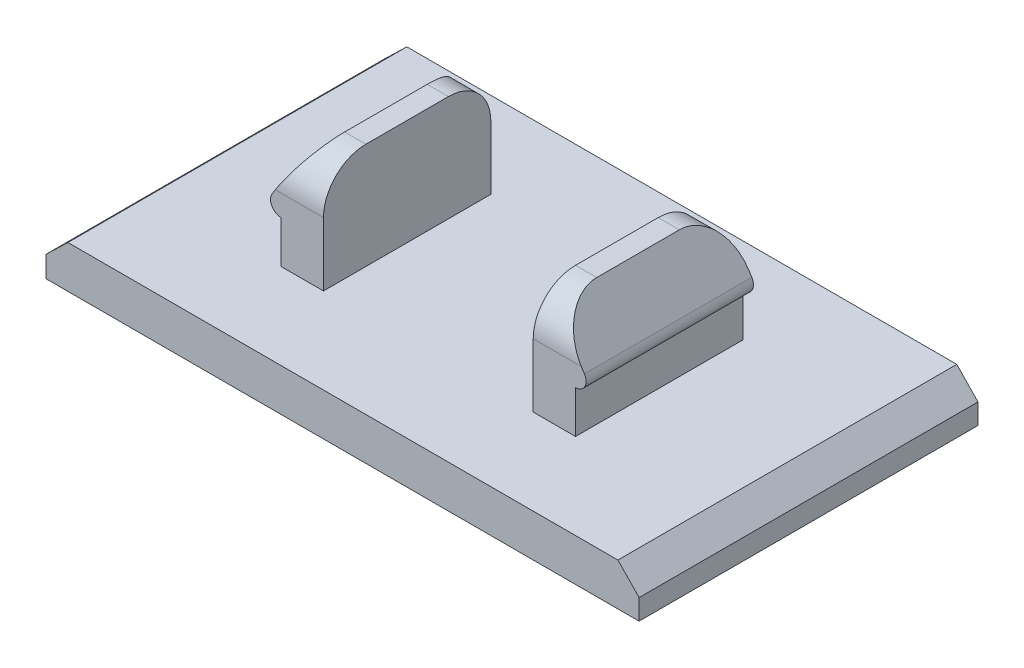
ISO-10303-21;
HEADER;
FILE_DESCRIPTION(('STEP AP214'),'2;1');
FILE_NAME('part.step','',(''),(''),'','','');
FILE_SCHEMA(('AUTOMOTIVE_DESIGN { 1 0 10303 214 1 1 1 1 }'));
ENDSEC;
DATA;
#1=APPLICATION_CONTEXT('core data for automotive mechanical design processes');
#2=APPLICATION_PROTOCOL_DEFINITION('international standard','automotive_design',2000,#1);
#3=PRODUCT_CONTEXT('',#1,'mechanical');
#4=PRODUCT('Part','Part','',(#3));
#5=PRODUCT_RELATED_PRODUCT_CATEGORY('part','',(#4));
#6=PRODUCT_DEFINITION_FORMATION('','',#4);
#7=PRODUCT_DEFINITION_CONTEXT('part definition',#1,'design');
#8=PRODUCT_DEFINITION('design','',#6,#7);
#9=PRODUCT_DEFINITION_SHAPE('','',#8);
#10=(LENGTH_UNIT() NAMED_UNIT(*) SI_UNIT(.MILLI.,.METRE.));
#11=(NAMED_UNIT(*) PLANE_ANGLE_UNIT() SI_UNIT($,.RADIAN.));
#12=(NAMED_UNIT(*) SI_UNIT($,.STERADIAN.) SOLID_ANGLE_UNIT());
#13=UNCERTAINTY_MEASURE_WITH_UNIT(LENGTH_MEASURE(1.E-05),#10,'distance_accuracy_value','');
#14=(GEOMETRIC_REPRESENTATION_CONTEXT(3) GLOBAL_UNCERTAINTY_ASSIGNED_CONTEXT((#13)) GLOBAL_UNIT_ASSIGNED_CONTEXT((#10,
#11,#12)) REPRESENTATION_CONTEXT('',''));
#15=CARTESIAN_POINT('',(0.,0.,0.));
#16=DIRECTION('',(0.,0.,1.));
#17=DIRECTION('',(1.,0.,0.));
#18=AXIS2_PLACEMENT_3D('',#15,#16,#17);
#19=CARTESIAN_POINT('',(6.94999999999999,7.,0.));
#20=DIRECTION('',(1.,0.,0.));
#21=DIRECTION('',(0.,0.,-1.));
#22=AXIS2_PLACEMENT_3D('',#19,#20,#21);
#23=PLANE('',#22);
#24=DIRECTION('',(0.,-1.,0.));
#25=VECTOR('',#24,1.);
#26=CARTESIAN_POINT('',(6.95,7.,-3.95));
#27=LINE('',#26,#25);
#28=CARTESIAN_POINT('',(6.95,4.,-3.95));
#29=VERTEX_POINT('',#28);
#30=CARTESIAN_POINT('',(6.95,2.,-3.95));
#31=VERTEX_POINT('',#30);
#32=EDGE_CURVE('E251',#29,#31,#27,.T.);
#33=ORIENTED_EDGE('',*,*,#32,.F.);
#34=DIRECTION('',(0.,0.,1.));
#35=VECTOR('',#34,1.);
#36=CARTESIAN_POINT('',(6.95,4.,-7.30410196624968));
#37=LINE('',#36,#35);
#38=CARTESIAN_POINT('',(6.94999999999998,4.,3.95000000000001));
#39=VERTEX_POINT('',#38);
#40=EDGE_CURVE('E379',#29,#39,#37,.T.);
#41=ORIENTED_EDGE('',*,*,#40,.T.);
#42=DIRECTION('',(0.,-1.,0.));
#43=VECTOR('',#42,1.);
#44=CARTESIAN_POINT('',(6.94999999999998,7.,3.95000000000001));
#45=LINE('',#44,#43);
#46=CARTESIAN_POINT('',(6.94999999999998,2.,3.95000000000001));
#47=VERTEX_POINT('',#46);
#48=EDGE_CURVE('E220',#39,#47,#45,.T.);
#49=ORIENTED_EDGE('',*,*,#48,.T.);
#50=DIRECTION('',(0.,0.,-1.));
#51=VECTOR('',#50,1.);
#52=CARTESIAN_POINT('',(6.94999999999999,2.,0.));
#53=LINE('',#52,#51);
#54=EDGE_CURVE('E262',#47,#31,#53,.T.);
#55=ORIENTED_EDGE('',*,*,#54,.T.);
#56=EDGE_LOOP('',(#33,#41,#49,#55));
#57=FACE_BOUND('',#56,.T.);
#58=ADVANCED_FACE('F43',(#57),#23,.T.);
#59=CARTESIAN_POINT('',(0.,7.,-3.95));
#60=DIRECTION('',(0.,0.,-1.));
#61=DIRECTION('',(-1.,0.,0.));
#62=AXIS2_PLACEMENT_3D('',#59,#60,#61);
#63=PLANE('',#62);
#64=DIRECTION('',(0.,-1.,0.));
#65=VECTOR('',#64,1.);
#66=CARTESIAN_POINT('',(4.95000000000002,7.,-3.95));
#67=LINE('',#66,#65);
#68=CARTESIAN_POINT('',(4.95000000000002,5.,-3.95));
#69=VERTEX_POINT('',#68);
#70=CARTESIAN_POINT('',(4.95000000000001,2.,-3.95));
#71=VERTEX_POINT('',#70);
#72=EDGE_CURVE('E259',#69,#71,#67,.T.);
#73=ORIENTED_EDGE('',*,*,#72,.F.);
#74=DIRECTION('',(1.,0.,0.));
#75=VECTOR('',#74,1.);
#76=CARTESIAN_POINT('',(0.,5.,-3.95));
#77=LINE('',#76,#75);
#78=CARTESIAN_POINT('',(7.22429188517741,5.,-3.95));
#79=VERTEX_POINT('',#78);
#80=EDGE_CURVE('E382',#69,#79,#77,.T.);
#81=ORIENTED_EDGE('',*,*,#80,.T.);
#82=DIRECTION('',(0.537345008422702,-0.843362521056756,0.));
#83=VECTOR('',#82,1.);
#84=CARTESIAN_POINT('',(4.23199903444307,9.69640101383476,-3.95));
#85=LINE('',#84,#83);
#86=CARTESIAN_POINT('',(7.37168126052836,4.76867250421135,-3.95));
#87=VERTEX_POINT('',#86);
#88=EDGE_CURVE('E240',#79,#87,#85,.T.);
#89=ORIENTED_EDGE('',*,*,#88,.T.);
#90=CARTESIAN_POINT('',(6.94999999999998,4.5,-3.95));
#91=DIRECTION('',(0.,0.,-1.));
#92=DIRECTION('',(-1.,0.,0.));
#93=AXIS2_PLACEMENT_3D('',#90,#91,#92);
#94=CIRCLE('',#93,0.5);
#95=EDGE_CURVE('E214',#87,#29,#94,.T.);
#96=ORIENTED_EDGE('',*,*,#95,.T.);
#97=ORIENTED_EDGE('',*,*,#32,.T.);
#98=DIRECTION('',(-1.,0.,0.));
#99=VECTOR('',#98,1.);
#100=CARTESIAN_POINT('',(0.,2.,-3.95));
#101=LINE('',#100,#99);
#102=EDGE_CURVE('E274',#31,#71,#101,.T.);
#103=ORIENTED_EDGE('',*,*,#102,.T.);
#104=EDGE_LOOP('',(#73,#81,#89,#96,#97,#103));
#105=FACE_BOUND('',#104,.T.);
#106=ADVANCED_FACE('F469',(#105),#63,.T.);
#107=CARTESIAN_POINT('',(0.,7.,3.95000000000001));
#108=DIRECTION('',(0.,0.,-1.));
#109=DIRECTION('',(-1.,0.,0.));
#110=AXIS2_PLACEMENT_3D('',#107,#108,#109);
#111=PLANE('',#110);
#112=DIRECTION('',(-0.537345008422702,0.843362521056756,0.));
#113=VECTOR('',#112,1.);
#114=CARTESIAN_POINT('',(7.4042355213075,4.71757862037232,3.95000000000001));
#115=LINE('',#114,#113);
#116=CARTESIAN_POINT('',(7.37168126052836,4.76867250421135,3.95000000000001));
#117=VERTEX_POINT('',#116);
#118=CARTESIAN_POINT('',(7.22429188517741,5.,3.95000000000001));
#119=VERTEX_POINT('',#118);
#120=EDGE_CURVE('E194',#117,#119,#115,.T.);
#121=ORIENTED_EDGE('',*,*,#120,.T.);
#122=DIRECTION('',(1.,0.,0.));
#123=VECTOR('',#122,1.);
#124=CARTESIAN_POINT('',(4.95000000000002,5.,3.95000000000001));
#125=LINE('',#124,#123);
#126=CARTESIAN_POINT('',(4.95000000000002,5.,3.95000000000001));
#127=VERTEX_POINT('',#126);
#128=EDGE_CURVE('E404',#119,#127,#125,.F.);
#129=ORIENTED_EDGE('',*,*,#128,.T.);
#130=DIRECTION('',(0.,-1.,0.));
#131=VECTOR('',#130,1.);
#132=CARTESIAN_POINT('',(4.95000000000002,7.,3.95000000000001));
#133=LINE('',#132,#131);
#134=CARTESIAN_POINT('',(4.95000000000002,2.,3.95000000000001));
#135=VERTEX_POINT('',#134);
#136=EDGE_CURVE('E256',#127,#135,#133,.T.);
#137=ORIENTED_EDGE('',*,*,#136,.T.);
#138=DIRECTION('',(-1.,0.,0.));
#139=VECTOR('',#138,1.);
#140=CARTESIAN_POINT('',(0.,2.,3.95000000000001));
#141=LINE('',#140,#139);
#142=EDGE_CURVE('E266',#47,#135,#141,.T.);
#143=ORIENTED_EDGE('',*,*,#142,.F.);
#144=ORIENTED_EDGE('',*,*,#48,.F.);
#145=CARTESIAN_POINT('',(6.94999999999998,4.5,3.95000000000001));
#146=DIRECTION('',(0.,0.,1.));
#147=DIRECTION('',(1.,0.,0.));
#148=AXIS2_PLACEMENT_3D('',#145,#146,#147);
#149=CIRCLE('',#148,0.5);
#150=EDGE_CURVE('E211',#117,#39,#149,.F.);
#151=ORIENTED_EDGE('',*,*,#150,.F.);
#152=EDGE_LOOP('',(#121,#129,#137,#143,#144,#151));
#153=FACE_BOUND('',#152,.T.);
#154=ADVANCED_FACE('F218',(#153),#111,.F.);
#155=CARTESIAN_POINT('',(0.,7.,0.));
#156=DIRECTION('',(0.,1.,0.));
#157=DIRECTION('',(0.,0.,1.));
#158=AXIS2_PLACEMENT_3D('',#155,#156,#157);
#159=PLANE('',#158);
#160=DIRECTION('',(0.,0.,-1.));
#161=VECTOR('',#160,1.);
#162=CARTESIAN_POINT('',(5.94999999999998,7.,0.));
#163=LINE('',#162,#161);
#164=CARTESIAN_POINT('',(5.94999999999998,7.,1.95000000000001));
#165=VERTEX_POINT('',#164);
#166=CARTESIAN_POINT('',(5.94999999999998,7.,-1.95));
#167=VERTEX_POINT('',#166);
#168=EDGE_CURVE('E372',#165,#167,#163,.T.);
#169=ORIENTED_EDGE('',*,*,#168,.T.);
#170=DIRECTION('',(1.,0.,0.));
#171=VECTOR('',#170,1.);
#172=CARTESIAN_POINT('',(0.,7.,-1.95));
#173=LINE('',#172,#171);
#174=CARTESIAN_POINT('',(4.95000000000001,7.,-1.95));
#175=VERTEX_POINT('',#174);
#176=EDGE_CURVE('E395',#167,#175,#173,.F.);
#177=ORIENTED_EDGE('',*,*,#176,.T.);
#178=DIRECTION('',(0.,0.,1.));
#179=VECTOR('',#178,1.);
#180=CARTESIAN_POINT('',(4.95000000000001,7.,0.));
#181=LINE('',#180,#179);
#182=CARTESIAN_POINT('',(4.95000000000001,7.,1.95000000000001));
#183=VERTEX_POINT('',#182);
#184=EDGE_CURVE('E247',#175,#183,#181,.T.);
#185=ORIENTED_EDGE('',*,*,#184,.T.);
#186=DIRECTION('',(1.,0.,0.));
#187=VECTOR('',#186,1.);
#188=CARTESIAN_POINT('',(5.94999999999999,7.,1.95000000000001));
#189=LINE('',#188,#187);
#190=EDGE_CURVE('E391',#183,#165,#189,.T.);
#191=ORIENTED_EDGE('',*,*,#190,.T.);
#192=EDGE_LOOP('',(#169,#177,#185,#191));
#193=FACE_BOUND('',#192,.T.);
#194=ADVANCED_FACE('F480',(#193),#159,.T.);
#195=CARTESIAN_POINT('',(0.,2.,0.));
#196=DIRECTION('',(0.,1.,0.));
#197=DIRECTION('',(0.,0.,1.));
#198=AXIS2_PLACEMENT_3D('',#195,#196,#197);
#199=PLANE('',#198);
#200=ORIENTED_EDGE('',*,*,#102,.F.);
#201=ORIENTED_EDGE('',*,*,#54,.F.);
#202=ORIENTED_EDGE('',*,*,#142,.T.);
#203=DIRECTION('',(0.,0.,-1.));
#204=VECTOR('',#203,1.);
#205=CARTESIAN_POINT('',(4.95000000000001,2.,0.));
#206=LINE('',#205,#204);
#207=EDGE_CURVE('E270',#135,#71,#206,.T.);
#208=ORIENTED_EDGE('',*,*,#207,.T.);
#209=EDGE_LOOP('',(#200,#201,#202,#208));
#210=FACE_BOUND('',#209,.T.);
#211=DIRECTION('',(1.,0.,0.));
#212=VECTOR('',#211,1.);
#213=CARTESIAN_POINT('',(-14.,2.,8.));
#214=LINE('',#213,#212);
#215=CARTESIAN_POINT('',(-12.9644696862094,2.,8.));
#216=VERTEX_POINT('',#215);
#217=CARTESIAN_POINT('',(13.,2.,8.));
#218=VERTEX_POINT('',#217);
#219=EDGE_CURVE('E311',#216,#218,#214,.T.);
#220=ORIENTED_EDGE('',*,*,#219,.T.);
#221=DIRECTION('',(0.,0.,-1.));
#222=VECTOR('',#221,1.);
#223=CARTESIAN_POINT('',(13.,2.,0.));
#224=LINE('',#223,#222);
#225=CARTESIAN_POINT('',(13.,2.,-8.));
#226=VERTEX_POINT('',#225);
#227=EDGE_CURVE('E360',#218,#226,#224,.T.);
#228=ORIENTED_EDGE('',*,*,#227,.T.);
#229=DIRECTION('',(1.,0.,0.));
#230=VECTOR('',#229,1.);
#231=CARTESIAN_POINT('',(-14.,2.,-8.));
#232=LINE('',#231,#230);
#233=CARTESIAN_POINT('',(-12.9644696862094,2.,-8.));
#234=VERTEX_POINT('',#233);
#235=EDGE_CURVE('E315',#234,#226,#232,.T.);
#236=ORIENTED_EDGE('',*,*,#235,.F.);
#237=DIRECTION('',(0.,0.,1.));
#238=VECTOR('',#237,1.);
#239=CARTESIAN_POINT('',(-12.9644696862094,2.,8.));
#240=LINE('',#239,#238);
#241=EDGE_CURVE('E356',#234,#216,#240,.T.);
#242=ORIENTED_EDGE('',*,*,#241,.T.);
#243=EDGE_LOOP('',(#220,#228,#236,#242));
#244=FACE_BOUND('',#243,.T.);
#245=DIRECTION('',(-1.,0.,0.));
#246=VECTOR('',#245,1.);
#247=CARTESIAN_POINT('',(0.,2.,3.95000000000001));
#248=LINE('',#247,#246);
#249=CARTESIAN_POINT('',(-4.94999999999999,2.,3.95000000000001));
#250=VERTEX_POINT('',#249);
#251=CARTESIAN_POINT('',(-6.94999999999998,2.,3.95000000000001));
#252=VERTEX_POINT('',#251);
#253=EDGE_CURVE('E302',#250,#252,#248,.T.);
#254=ORIENTED_EDGE('',*,*,#253,.T.);
#255=DIRECTION('',(0.,0.,-1.));
#256=VECTOR('',#255,1.);
#257=CARTESIAN_POINT('',(-6.94999999999999,2.,0.));
#258=LINE('',#257,#256);
#259=CARTESIAN_POINT('',(-6.95,2.,-3.95));
#260=VERTEX_POINT('',#259);
#261=EDGE_CURVE('E306',#252,#260,#258,.T.);
#262=ORIENTED_EDGE('',*,*,#261,.T.);
#263=DIRECTION('',(-1.,0.,0.));
#264=VECTOR('',#263,1.);
#265=CARTESIAN_POINT('',(0.,2.,-3.95));
#266=LINE('',#265,#264);
#267=CARTESIAN_POINT('',(-4.94999999999999,2.,-3.95));
#268=VERTEX_POINT('',#267);
#269=EDGE_CURVE('E294',#268,#260,#266,.T.);
#270=ORIENTED_EDGE('',*,*,#269,.F.);
#271=DIRECTION('',(0.,0.,-1.));
#272=VECTOR('',#271,1.);
#273=CARTESIAN_POINT('',(-4.94999999999999,2.,0.));
#274=LINE('',#273,#272);
#275=EDGE_CURVE('E298',#250,#268,#274,.T.);
#276=ORIENTED_EDGE('',*,*,#275,.F.);
#277=EDGE_LOOP('',(#254,#262,#270,#276));
#278=FACE_BOUND('',#277,.T.);
#279=ADVANCED_FACE('F451',(#210,#244,#278),#199,.T.);
#280=CARTESIAN_POINT('',(-14.,2.,-8.));
#281=DIRECTION('',(1.,0.,0.));
#282=DIRECTION('',(0.,0.,-1.));
#283=AXIS2_PLACEMENT_3D('',#280,#281,#282);
#284=PLANE('',#283);
#285=DIRECTION('',(0.,-1.,0.));
#286=VECTOR('',#285,1.);
#287=CARTESIAN_POINT('',(-14.,2.,8.));
#288=LINE('',#287,#286);
#289=CARTESIAN_POINT('',(-14.,1.,8.));
#290=VERTEX_POINT('',#289);
#291=CARTESIAN_POINT('',(-14.,0.,8.));
#292=VERTEX_POINT('',#291);
#293=EDGE_CURVE('E343',#290,#292,#288,.T.);
#294=ORIENTED_EDGE('',*,*,#293,.F.);
#295=DIRECTION('',(0.,0.,-1.));
#296=VECTOR('',#295,1.);
#297=CARTESIAN_POINT('',(-14.,1.,-8.));
#298=LINE('',#297,#296);
#299=CARTESIAN_POINT('',(-14.,1.,-8.));
#300=VERTEX_POINT('',#299);
#301=EDGE_CURVE('E369',#290,#300,#298,.T.);
#302=ORIENTED_EDGE('',*,*,#301,.T.);
#303=DIRECTION('',(0.,-1.,0.));
#304=VECTOR('',#303,1.);
#305=CARTESIAN_POINT('',(-14.,2.,-8.));
#306=LINE('',#305,#304);
#307=CARTESIAN_POINT('',(-14.,0.,-8.));
#308=VERTEX_POINT('',#307);
#309=EDGE_CURVE('E320',#300,#308,#306,.T.);
#310=ORIENTED_EDGE('',*,*,#309,.T.);
#311=DIRECTION('',(0.,0.,1.));
#312=VECTOR('',#311,1.);
#313=CARTESIAN_POINT('',(-14.,0.,-8.));
#314=LINE('',#313,#312);
#315=EDGE_CURVE('E310',#308,#292,#314,.T.);
#316=ORIENTED_EDGE('',*,*,#315,.T.);
#317=EDGE_LOOP('',(#294,#302,#310,#316));
#318=FACE_BOUND('',#317,.T.);
#319=ADVANCED_FACE('F501',(#318),#284,.F.);
#320=CARTESIAN_POINT('',(-14.,2.,8.));
#321=DIRECTION('',(0.,0.,-1.));
#322=DIRECTION('',(-1.,0.,0.));
#323=AXIS2_PLACEMENT_3D('',#320,#321,#322);
#324=PLANE('',#323);
#325=DIRECTION('',(0.,-1.,0.));
#326=VECTOR('',#325,1.);
#327=CARTESIAN_POINT('',(14.,2.,8.));
#328=LINE('',#327,#326);
#329=CARTESIAN_POINT('',(14.,0.964469686209437,8.));
#330=VERTEX_POINT('',#329);
#331=CARTESIAN_POINT('',(14.,0.,8.));
#332=VERTEX_POINT('',#331);
#333=EDGE_CURVE('E340',#330,#332,#328,.T.);
#334=ORIENTED_EDGE('',*,*,#333,.F.);
#335=DIRECTION('',(0.694658370458999,-0.71933980033865,0.));
#336=VECTOR('',#335,1.);
#337=CARTESIAN_POINT('',(14.,0.964469686209437,8.));
#338=LINE('',#337,#336);
#339=EDGE_CURVE('E353',#330,#218,#338,.F.);
#340=ORIENTED_EDGE('',*,*,#339,.T.);
#341=ORIENTED_EDGE('',*,*,#219,.F.);
#342=DIRECTION('',(-0.71933980033865,-0.694658370458999,0.));
#343=VECTOR('',#342,1.);
#344=CARTESIAN_POINT('',(-12.9644696862094,2.,8.));
#345=LINE('',#344,#343);
#346=EDGE_CURVE('E350',#216,#290,#345,.T.);
#347=ORIENTED_EDGE('',*,*,#346,.T.);
#348=ORIENTED_EDGE('',*,*,#293,.T.);
#349=DIRECTION('',(1.,0.,0.));
#350=VECTOR('',#349,1.);
#351=CARTESIAN_POINT('',(-14.,0.,8.));
#352=LINE('',#351,#350);
#353=EDGE_CURVE('E324',#292,#332,#352,.T.);
#354=ORIENTED_EDGE('',*,*,#353,.T.);
#355=EDGE_LOOP('',(#334,#340,#341,#347,#348,#354));
#356=FACE_BOUND('',#355,.T.);
#357=ADVANCED_FACE('F515',(#356),#324,.F.);
#358=CARTESIAN_POINT('',(14.,2.,-8.));
#359=DIRECTION('',(1.,0.,0.));
#360=DIRECTION('',(0.,0.,-1.));
#361=AXIS2_PLACEMENT_3D('',#358,#359,#360);
#362=PLANE('',#361);
#363=DIRECTION('',(0.,-1.,0.));
#364=VECTOR('',#363,1.);
#365=CARTESIAN_POINT('',(14.,2.,-8.));
#366=LINE('',#365,#364);
#367=CARTESIAN_POINT('',(14.,0.964469686209437,-8.));
#368=VERTEX_POINT('',#367);
#369=CARTESIAN_POINT('',(14.,0.,-8.));
#370=VERTEX_POINT('',#369);
#371=EDGE_CURVE('E337',#368,#370,#366,.T.);
#372=ORIENTED_EDGE('',*,*,#371,.F.);
#373=DIRECTION('',(0.,0.,1.));
#374=VECTOR('',#373,1.);
#375=CARTESIAN_POINT('',(14.,0.964469686209437,-8.));
#376=LINE('',#375,#374);
#377=EDGE_CURVE('E346',#368,#330,#376,.T.);
#378=ORIENTED_EDGE('',*,*,#377,.T.);
#379=ORIENTED_EDGE('',*,*,#333,.T.);
#380=DIRECTION('',(0.,0.,1.));
#381=VECTOR('',#380,1.);
#382=CARTESIAN_POINT('',(14.,0.,-8.));
#383=LINE('',#382,#381);
#384=EDGE_CURVE('E328',#370,#332,#383,.T.);
#385=ORIENTED_EDGE('',*,*,#384,.F.);
#386=EDGE_LOOP('',(#372,#378,#379,#385));
#387=FACE_BOUND('',#386,.T.);
#388=ADVANCED_FACE('F511',(#387),#362,.T.);
#389=CARTESIAN_POINT('',(-14.,2.,-8.));
#390=DIRECTION('',(0.,0.,-1.));
#391=DIRECTION('',(-1.,0.,0.));
#392=AXIS2_PLACEMENT_3D('',#389,#390,#391);
#393=PLANE('',#392);
#394=ORIENTED_EDGE('',*,*,#235,.T.);
#395=DIRECTION('',(-0.694658370458999,0.71933980033865,0.));
#396=VECTOR('',#395,1.);
#397=CARTESIAN_POINT('',(-0.0288567945162885,15.4917761647578,-8.));
#398=LINE('',#397,#396);
#399=EDGE_CURVE('E366',#226,#368,#398,.F.);
#400=ORIENTED_EDGE('',*,*,#399,.T.);
#401=ORIENTED_EDGE('',*,*,#371,.T.);
#402=DIRECTION('',(1.,0.,0.));
#403=VECTOR('',#402,1.);
#404=CARTESIAN_POINT('',(-14.,0.,-8.));
#405=LINE('',#404,#403);
#406=EDGE_CURVE('E316',#308,#370,#405,.T.);
#407=ORIENTED_EDGE('',*,*,#406,.F.);
#408=ORIENTED_EDGE('',*,*,#309,.F.);
#409=DIRECTION('',(0.71933980033865,0.694658370458999,0.));
#410=VECTOR('',#409,1.);
#411=CARTESIAN_POINT('',(-13.5003045864905,1.48255025164875,-8.));
#412=LINE('',#411,#410);
#413=EDGE_CURVE('E363',#300,#234,#412,.T.);
#414=ORIENTED_EDGE('',*,*,#413,.T.);
#415=EDGE_LOOP('',(#394,#400,#401,#407,#408,#414));
#416=FACE_BOUND('',#415,.T.);
#417=ADVANCED_FACE('F507',(#416),#393,.T.);
#418=CARTESIAN_POINT('',(0.,0.,0.));
#419=DIRECTION('',(0.,1.,0.));
#420=DIRECTION('',(0.,0.,1.));
#421=AXIS2_PLACEMENT_3D('',#418,#419,#420);
#422=PLANE('',#421);
#423=ORIENTED_EDGE('',*,*,#315,.F.);
#424=ORIENTED_EDGE('',*,*,#406,.T.);
#425=ORIENTED_EDGE('',*,*,#384,.T.);
#426=ORIENTED_EDGE('',*,*,#353,.F.);
#427=EDGE_LOOP('',(#423,#424,#425,#426));
#428=FACE_BOUND('',#427,.T.);
#429=ADVANCED_FACE('F503',(#428),#422,.F.);
#430=CARTESIAN_POINT('',(14.,0.964469686209437,-8.));
#431=DIRECTION('',(-0.71933980033865,-0.694658370458999,0.));
#432=DIRECTION('',(0.,0.,1.));
#433=AXIS2_PLACEMENT_3D('',#430,#431,#432);
#434=PLANE('',#433);
#435=ORIENTED_EDGE('',*,*,#399,.F.);
#436=ORIENTED_EDGE('',*,*,#227,.F.);
#437=ORIENTED_EDGE('',*,*,#339,.F.);
#438=ORIENTED_EDGE('',*,*,#377,.F.);
#439=EDGE_LOOP('',(#435,#436,#437,#438));
#440=FACE_BOUND('',#439,.T.);
#441=ADVANCED_FACE('F506',(#440),#434,.F.);
#442=CARTESIAN_POINT('',(-12.9644696862094,2.,0.));
#443=DIRECTION('',(-0.694658370458999,0.71933980033865,0.));
#444=DIRECTION('',(0.,0.,-1.));
#445=AXIS2_PLACEMENT_3D('',#442,#443,#444);
#446=PLANE('',#445);
#447=ORIENTED_EDGE('',*,*,#413,.F.);
#448=ORIENTED_EDGE('',*,*,#301,.F.);
#449=ORIENTED_EDGE('',*,*,#346,.F.);
#450=ORIENTED_EDGE('',*,*,#241,.F.);
#451=EDGE_LOOP('',(#447,#448,#449,#450));
#452=FACE_BOUND('',#451,.T.);
#453=ADVANCED_FACE('F498',(#452),#446,.T.);
#454=CARTESIAN_POINT('',(-6.94999999999999,7.,0.));
#455=DIRECTION('',(1.,0.,0.));
#456=DIRECTION('',(0.,0.,-1.));
#457=AXIS2_PLACEMENT_3D('',#454,#455,#456);
#458=PLANE('',#457);
#459=DIRECTION('',(0.,-1.,0.));
#460=VECTOR('',#459,1.);
#461=CARTESIAN_POINT('',(-6.94999999999998,7.,3.95000000000001));
#462=LINE('',#461,#460);
#463=CARTESIAN_POINT('',(-6.94999999999998,4.,3.95000000000001));
#464=VERTEX_POINT('',#463);
#465=EDGE_CURVE('E291',#464,#252,#462,.T.);
#466=ORIENTED_EDGE('',*,*,#465,.F.);
#467=DIRECTION('',(0.,0.,1.));
#468=VECTOR('',#467,1.);
#469=CARTESIAN_POINT('',(-6.94999999999998,4.,-7.30410196624968));
#470=LINE('',#469,#468);
#471=CARTESIAN_POINT('',(-6.94999999999998,4.,-3.95));
#472=VERTEX_POINT('',#471);
#473=EDGE_CURVE('E225',#472,#464,#470,.T.);
#474=ORIENTED_EDGE('',*,*,#473,.F.);
#475=DIRECTION('',(0.,-1.,0.));
#476=VECTOR('',#475,1.);
#477=CARTESIAN_POINT('',(-6.95,7.,-3.95));
#478=LINE('',#477,#476);
#479=EDGE_CURVE('E282',#472,#260,#478,.T.);
#480=ORIENTED_EDGE('',*,*,#479,.T.);
#481=ORIENTED_EDGE('',*,*,#261,.F.);
#482=EDGE_LOOP('',(#466,#474,#480,#481));
#483=FACE_BOUND('',#482,.T.);
#484=ADVANCED_FACE('F454',(#483),#458,.F.);
#485=CARTESIAN_POINT('',(0.,7.,3.95000000000001));
#486=DIRECTION('',(0.,0.,-1.));
#487=DIRECTION('',(-1.,0.,0.));
#488=AXIS2_PLACEMENT_3D('',#485,#486,#487);
#489=PLANE('',#488);
#490=DIRECTION('',(0.,-1.,0.));
#491=VECTOR('',#490,1.);
#492=CARTESIAN_POINT('',(-4.94999999999999,7.,3.95000000000001));
#493=LINE('',#492,#491);
#494=CARTESIAN_POINT('',(-4.94999999999999,5.,3.95000000000001));
#495=VERTEX_POINT('',#494);
#496=EDGE_CURVE('E288',#495,#250,#493,.T.);
#497=ORIENTED_EDGE('',*,*,#496,.F.);
#498=DIRECTION('',(1.,0.,0.));
#499=VECTOR('',#498,1.);
#500=CARTESIAN_POINT('',(-5.94999999999998,5.,3.95000000000001));
#501=LINE('',#500,#499);
#502=CARTESIAN_POINT('',(-7.22429188517741,5.,3.95000000000001));
#503=VERTEX_POINT('',#502);
#504=EDGE_CURVE('E11',#495,#503,#501,.F.);
#505=ORIENTED_EDGE('',*,*,#504,.T.);
#506=DIRECTION('',(0.537345008422702,0.843362521056756,0.));
#507=VECTOR('',#506,1.);
#508=CARTESIAN_POINT('',(-7.4042355213075,4.71757862037232,3.95000000000001));
#509=LINE('',#508,#507);
#510=CARTESIAN_POINT('',(-7.37168126052836,4.76867250421135,3.95000000000001));
#511=VERTEX_POINT('',#510);
#512=EDGE_CURVE('E205',#511,#503,#509,.T.);
#513=ORIENTED_EDGE('',*,*,#512,.F.);
#514=CARTESIAN_POINT('',(-6.94999999999998,4.5,3.95000000000001));
#515=DIRECTION('',(0.,0.,1.));
#516=DIRECTION('',(1.,0.,0.));
#517=AXIS2_PLACEMENT_3D('',#514,#515,#516);
#518=CIRCLE('',#517,0.5);
#519=EDGE_CURVE('E206',#511,#464,#518,.T.);
#520=ORIENTED_EDGE('',*,*,#519,.T.);
#521=ORIENTED_EDGE('',*,*,#465,.T.);
#522=ORIENTED_EDGE('',*,*,#253,.F.);
#523=EDGE_LOOP('',(#497,#505,#513,#520,#521,#522));
#524=FACE_BOUND('',#523,.T.);
#525=ADVANCED_FACE('F447',(#524),#489,.F.);
#526=CARTESIAN_POINT('',(-4.94999999999999,7.,0.));
#527=DIRECTION('',(1.,0.,0.));
#528=DIRECTION('',(0.,0.,-1.));
#529=AXIS2_PLACEMENT_3D('',#526,#527,#528);
#530=PLANE('',#529);
#531=DIRECTION('',(0.,-1.,0.));
#532=VECTOR('',#531,1.);
#533=CARTESIAN_POINT('',(-4.94999999999999,7.,-3.95));
#534=LINE('',#533,#532);
#535=CARTESIAN_POINT('',(-4.94999999999999,5.,-3.95));
#536=VERTEX_POINT('',#535);
#537=EDGE_CURVE('E285',#536,#268,#534,.T.);
#538=ORIENTED_EDGE('',*,*,#537,.F.);
#539=CARTESIAN_POINT('',(-4.94999999999999,5.,-1.95));
#540=DIRECTION('',(1.,0.,0.));
#541=DIRECTION('',(0.,0.,-1.));
#542=AXIS2_PLACEMENT_3D('',#539,#540,#541);
#543=CIRCLE('',#542,2.);
#544=CARTESIAN_POINT('',(-4.94999999999999,7.,-1.95));
#545=VERTEX_POINT('',#544);
#546=EDGE_CURVE('E414',#536,#545,#543,.T.);
#547=ORIENTED_EDGE('',*,*,#546,.T.);
#548=DIRECTION('',(0.,0.,1.));
#549=VECTOR('',#548,1.);
#550=CARTESIAN_POINT('',(-4.94999999999999,7.,0.));
#551=LINE('',#550,#549);
#552=CARTESIAN_POINT('',(-4.94999999999999,7.,1.95000000000001));
#553=VERTEX_POINT('',#552);
#554=EDGE_CURVE('E278',#545,#553,#551,.T.);
#555=ORIENTED_EDGE('',*,*,#554,.T.);
#556=CARTESIAN_POINT('',(-4.94999999999999,5.,1.95000000000001));
#557=DIRECTION('',(1.,0.,0.));
#558=DIRECTION('',(0.,0.,-1.));
#559=AXIS2_PLACEMENT_3D('',#556,#557,#558);
#560=CIRCLE('',#559,2.);
#561=EDGE_CURVE('E411',#553,#495,#560,.T.);
#562=ORIENTED_EDGE('',*,*,#561,.T.);
#563=ORIENTED_EDGE('',*,*,#496,.T.);
#564=ORIENTED_EDGE('',*,*,#275,.T.);
#565=EDGE_LOOP('',(#538,#547,#555,#562,#563,#564));
#566=FACE_BOUND('',#565,.T.);
#567=ADVANCED_FACE('F440',(#566),#530,.T.);
#568=CARTESIAN_POINT('',(0.,7.,-3.95));
#569=DIRECTION('',(0.,0.,-1.));
#570=DIRECTION('',(-1.,0.,0.));
#571=AXIS2_PLACEMENT_3D('',#568,#569,#570);
#572=PLANE('',#571);
#573=DIRECTION('',(-0.537345008422702,-0.843362521056756,0.));
#574=VECTOR('',#573,1.);
#575=CARTESIAN_POINT('',(-4.23199903444307,9.69640101383476,-3.95));
#576=LINE('',#575,#574);
#577=CARTESIAN_POINT('',(-7.22429188517741,5.,-3.95));
#578=VERTEX_POINT('',#577);
#579=CARTESIAN_POINT('',(-7.37168126052836,4.76867250421135,-3.95));
#580=VERTEX_POINT('',#579);
#581=EDGE_CURVE('E244',#578,#580,#576,.T.);
#582=ORIENTED_EDGE('',*,*,#581,.F.);
#583=DIRECTION('',(1.,0.,0.));
#584=VECTOR('',#583,1.);
#585=CARTESIAN_POINT('',(0.,5.,-3.95));
#586=LINE('',#585,#584);
#587=EDGE_CURVE('E407',#578,#536,#586,.T.);
#588=ORIENTED_EDGE('',*,*,#587,.T.);
#589=ORIENTED_EDGE('',*,*,#537,.T.);
#590=ORIENTED_EDGE('',*,*,#269,.T.);
#591=ORIENTED_EDGE('',*,*,#479,.F.);
#592=CARTESIAN_POINT('',(-6.94999999999998,4.5,-3.95));
#593=DIRECTION('',(0.,0.,-1.));
#594=DIRECTION('',(-1.,0.,0.));
#595=AXIS2_PLACEMENT_3D('',#592,#593,#594);
#596=CIRCLE('',#595,0.5);
#597=EDGE_CURVE('E222',#580,#472,#596,.F.);
#598=ORIENTED_EDGE('',*,*,#597,.F.);
#599=EDGE_LOOP('',(#582,#588,#589,#590,#591,#598));
#600=FACE_BOUND('',#599,.T.);
#601=ADVANCED_FACE('F435',(#600),#572,.T.);
#602=CARTESIAN_POINT('',(0.,7.,0.));
#603=DIRECTION('',(0.,1.,0.));
#604=DIRECTION('',(0.,0.,1.));
#605=AXIS2_PLACEMENT_3D('',#602,#603,#604);
#606=PLANE('',#605);
#607=ORIENTED_EDGE('',*,*,#554,.F.);
#608=DIRECTION('',(1.,0.,0.));
#609=VECTOR('',#608,1.);
#610=CARTESIAN_POINT('',(0.,7.,-1.95));
#611=LINE('',#610,#609);
#612=CARTESIAN_POINT('',(-5.94999999999998,7.,-1.95));
#613=VERTEX_POINT('',#612);
#614=EDGE_CURVE('E65',#545,#613,#611,.F.);
#615=ORIENTED_EDGE('',*,*,#614,.T.);
#616=DIRECTION('',(0.,0.,-1.));
#617=VECTOR('',#616,1.);
#618=CARTESIAN_POINT('',(-5.94999999999998,7.,0.));
#619=LINE('',#618,#617);
#620=CARTESIAN_POINT('',(-5.94999999999998,7.,1.95000000000001));
#621=VERTEX_POINT('',#620);
#622=EDGE_CURVE('E376',#621,#613,#619,.T.);
#623=ORIENTED_EDGE('',*,*,#622,.F.);
#624=DIRECTION('',(1.,0.,0.));
#625=VECTOR('',#624,1.);
#626=CARTESIAN_POINT('',(-4.94999999999999,7.,1.95000000000001));
#627=LINE('',#626,#625);
#628=EDGE_CURVE('E417',#621,#553,#627,.T.);
#629=ORIENTED_EDGE('',*,*,#628,.T.);
#630=EDGE_LOOP('',(#607,#615,#623,#629));
#631=FACE_BOUND('',#630,.T.);
#632=ADVANCED_FACE('F441',(#631),#606,.T.);
#633=CARTESIAN_POINT('',(4.95000000000001,7.,0.));
#634=DIRECTION('',(1.,0.,0.));
#635=DIRECTION('',(0.,0.,-1.));
#636=AXIS2_PLACEMENT_3D('',#633,#634,#635);
#637=PLANE('',#636);
#638=ORIENTED_EDGE('',*,*,#184,.F.);
#639=CARTESIAN_POINT('',(4.95000000000001,5.,-1.95));
#640=DIRECTION('',(1.,0.,0.));
#641=DIRECTION('',(0.,0.,-1.));
#642=AXIS2_PLACEMENT_3D('',#639,#640,#641);
#643=CIRCLE('',#642,2.);
#644=EDGE_CURVE('E401',#175,#69,#643,.F.);
#645=ORIENTED_EDGE('',*,*,#644,.T.);
#646=ORIENTED_EDGE('',*,*,#72,.T.);
#647=ORIENTED_EDGE('',*,*,#207,.F.);
#648=ORIENTED_EDGE('',*,*,#136,.F.);
#649=CARTESIAN_POINT('',(4.95000000000001,5.,1.95000000000001));
#650=DIRECTION('',(1.,0.,0.));
#651=DIRECTION('',(0.,0.,-1.));
#652=AXIS2_PLACEMENT_3D('',#649,#650,#651);
#653=CIRCLE('',#652,2.);
#654=EDGE_CURVE('E398',#127,#183,#653,.F.);
#655=ORIENTED_EDGE('',*,*,#654,.T.);
#656=EDGE_LOOP('',(#638,#645,#646,#647,#648,#655));
#657=FACE_BOUND('',#656,.T.);
#658=ADVANCED_FACE('F484',(#657),#637,.F.);
#659=CARTESIAN_POINT('',(7.4042355213075,4.71757862037232,-8.));
#660=DIRECTION('',(0.843362521056756,0.537345008422702,0.));
#661=DIRECTION('',(-0.537345008422702,0.843362521056756,0.));
#662=AXIS2_PLACEMENT_3D('',#659,#660,#661);
#663=PLANE('',#662);
#664=ORIENTED_EDGE('',*,*,#88,.F.);
#665=CARTESIAN_POINT('',(7.22429188517741,5.,-1.95));
#666=DIRECTION('',(0.843362521056756,0.537345008422702,0.));
#667=DIRECTION('',(0.537345008422702,-0.843362521056756,0.));
#668=AXIS2_PLACEMENT_3D('',#665,#666,#667);
#669=ELLIPSE('',#668,2.37145942588716,2.);
#670=EDGE_CURVE('E388',#79,#167,#669,.T.);
#671=ORIENTED_EDGE('',*,*,#670,.T.);
#672=ORIENTED_EDGE('',*,*,#168,.F.);
#673=CARTESIAN_POINT('',(7.22429188517741,5.,1.95000000000001));
#674=DIRECTION('',(0.843362521056756,0.537345008422702,0.));
#675=DIRECTION('',(-0.537345008422702,0.843362521056756,0.));
#676=AXIS2_PLACEMENT_3D('',#673,#674,#675);
#677=ELLIPSE('',#676,2.37145942588716,2.);
#678=EDGE_CURVE('E200',#165,#119,#677,.T.);
#679=ORIENTED_EDGE('',*,*,#678,.T.);
#680=ORIENTED_EDGE('',*,*,#120,.F.);
#681=DIRECTION('',(0.,0.,1.));
#682=VECTOR('',#681,1.);
#683=CARTESIAN_POINT('',(7.37168126052836,4.76867250421135,-7.30410196624968));
#684=LINE('',#683,#682);
#685=EDGE_CURVE('E198',#87,#117,#684,.T.);
#686=ORIENTED_EDGE('',*,*,#685,.F.);
#687=EDGE_LOOP('',(#664,#671,#672,#679,#680,#686));
#688=FACE_BOUND('',#687,.T.);
#689=ADVANCED_FACE('F197',(#688),#663,.T.);
#690=CARTESIAN_POINT('',(-7.4042355213075,4.71757862037232,-8.));
#691=DIRECTION('',(0.843362521056756,-0.537345008422702,0.));
#692=DIRECTION('',(0.537345008422702,0.843362521056756,0.));
#693=AXIS2_PLACEMENT_3D('',#690,#691,#692);
#694=PLANE('',#693);
#695=ORIENTED_EDGE('',*,*,#622,.T.);
#696=CARTESIAN_POINT('',(-7.22429188517741,5.,-1.95));
#697=DIRECTION('',(0.843362521056756,-0.537345008422702,0.));
#698=DIRECTION('',(0.537345008422702,0.843362521056756,0.));
#699=AXIS2_PLACEMENT_3D('',#696,#697,#698);
#700=ELLIPSE('',#699,2.37145942588716,2.);
#701=EDGE_CURVE('E52',#613,#578,#700,.F.);
#702=ORIENTED_EDGE('',*,*,#701,.T.);
#703=ORIENTED_EDGE('',*,*,#581,.T.);
#704=DIRECTION('',(0.,0.,1.));
#705=VECTOR('',#704,1.);
#706=CARTESIAN_POINT('',(-7.37168126052836,4.76867250421135,-7.30410196624968));
#707=LINE('',#706,#705);
#708=EDGE_CURVE('E232',#580,#511,#707,.T.);
#709=ORIENTED_EDGE('',*,*,#708,.T.);
#710=ORIENTED_EDGE('',*,*,#512,.T.);
#711=CARTESIAN_POINT('',(-7.22429188517741,5.,1.95000000000001));
#712=DIRECTION('',(0.843362521056756,-0.537345008422702,0.));
#713=DIRECTION('',(-0.537345008422702,-0.843362521056756,0.));
#714=AXIS2_PLACEMENT_3D('',#711,#712,#713);
#715=ELLIPSE('',#714,2.37145942588716,2.);
#716=EDGE_CURVE('E423',#503,#621,#715,.F.);
#717=ORIENTED_EDGE('',*,*,#716,.T.);
#718=EDGE_LOOP('',(#695,#702,#703,#709,#710,#717));
#719=FACE_BOUND('',#718,.T.);
#720=ADVANCED_FACE('F429',(#719),#694,.F.);
#721=CARTESIAN_POINT('',(-6.94999999999998,4.5,-7.30410196624968));
#722=DIRECTION('',(0.,0.,1.));
#723=DIRECTION('',(1.,0.,0.));
#724=AXIS2_PLACEMENT_3D('',#721,#722,#723);
#725=CYLINDRICAL_SURFACE('',#724,0.5);
#726=ORIENTED_EDGE('',*,*,#708,.F.);
#727=ORIENTED_EDGE('',*,*,#597,.T.);
#728=ORIENTED_EDGE('',*,*,#473,.T.);
#729=ORIENTED_EDGE('',*,*,#519,.F.);
#730=EDGE_LOOP('',(#726,#727,#728,#729));
#731=FACE_BOUND('',#730,.T.);
#732=ADVANCED_FACE('F458',(#731),#725,.T.);
#733=CARTESIAN_POINT('',(6.94999999999998,4.5,-7.30410196624968));
#734=DIRECTION('',(0.,0.,1.));
#735=DIRECTION('',(1.,0.,0.));
#736=AXIS2_PLACEMENT_3D('',#733,#734,#735);
#737=CYLINDRICAL_SURFACE('',#736,0.5);
#738=ORIENTED_EDGE('',*,*,#40,.F.);
#739=ORIENTED_EDGE('',*,*,#95,.F.);
#740=ORIENTED_EDGE('',*,*,#685,.T.);
#741=ORIENTED_EDGE('',*,*,#150,.T.);
#742=EDGE_LOOP('',(#738,#739,#740,#741));
#743=FACE_BOUND('',#742,.T.);
#744=ADVANCED_FACE('F210',(#743),#737,.T.);
#745=CARTESIAN_POINT('',(0.,5.,-1.95));
#746=DIRECTION('',(1.,0.,0.));
#747=DIRECTION('',(0.,0.,-1.));
#748=AXIS2_PLACEMENT_3D('',#745,#746,#747);
#749=CYLINDRICAL_SURFACE('',#748,2.);
#750=ORIENTED_EDGE('',*,*,#644,.F.);
#751=ORIENTED_EDGE('',*,*,#176,.F.);
#752=ORIENTED_EDGE('',*,*,#670,.F.);
#753=ORIENTED_EDGE('',*,*,#80,.F.);
#754=EDGE_LOOP('',(#750,#751,#752,#753));
#755=FACE_BOUND('',#754,.T.);
#756=ADVANCED_FACE('F465',(#755),#749,.T.);
#757=CARTESIAN_POINT('',(0.,5.,1.95000000000001));
#758=DIRECTION('',(-1.,0.,0.));
#759=DIRECTION('',(0.,0.,1.));
#760=AXIS2_PLACEMENT_3D('',#757,#758,#759);
#761=CYLINDRICAL_SURFACE('',#760,2.);
#762=ORIENTED_EDGE('',*,*,#654,.F.);
#763=ORIENTED_EDGE('',*,*,#128,.F.);
#764=ORIENTED_EDGE('',*,*,#678,.F.);
#765=ORIENTED_EDGE('',*,*,#190,.F.);
#766=EDGE_LOOP('',(#762,#763,#764,#765));
#767=FACE_BOUND('',#766,.T.);
#768=ADVANCED_FACE('F537',(#767),#761,.T.);
#769=CARTESIAN_POINT('',(0.,5.,-1.95));
#770=DIRECTION('',(1.,0.,0.));
#771=DIRECTION('',(0.,0.,-1.));
#772=AXIS2_PLACEMENT_3D('',#769,#770,#771);
#773=CYLINDRICAL_SURFACE('',#772,2.);
#774=ORIENTED_EDGE('',*,*,#701,.F.);
#775=ORIENTED_EDGE('',*,*,#614,.F.);
#776=ORIENTED_EDGE('',*,*,#546,.F.);
#777=ORIENTED_EDGE('',*,*,#587,.F.);
#778=EDGE_LOOP('',(#774,#775,#776,#777));
#779=FACE_BOUND('',#778,.T.);
#780=ADVANCED_FACE('F438',(#779),#773,.T.);
#781=CARTESIAN_POINT('',(0.,5.,1.95000000000001));
#782=DIRECTION('',(-1.,0.,0.));
#783=DIRECTION('',(0.,0.,1.));
#784=AXIS2_PLACEMENT_3D('',#781,#782,#783);
#785=CYLINDRICAL_SURFACE('',#784,2.);
#786=ORIENTED_EDGE('',*,*,#716,.F.);
#787=ORIENTED_EDGE('',*,*,#504,.F.);
#788=ORIENTED_EDGE('',*,*,#561,.F.);
#789=ORIENTED_EDGE('',*,*,#628,.F.);
#790=EDGE_LOOP('',(#786,#787,#788,#789));
#791=FACE_BOUND('',#790,.T.);
#792=ADVANCED_FACE('F45',(#791),#785,.T.);
#793=CLOSED_SHELL('',(#58,#106,#154,#194,#279,#319,#357,#388,#417,#429,#441,#453,#484,#525,#567,
#601,#632,#658,#689,#720,#732,#744,#756,#768,#780,#792));
#794=MANIFOLD_SOLID_BREP('B2',#793);
#795=ADVANCED_BREP_SHAPE_REPRESENTATION('',(#18,#794),#14);
#796=SHAPE_DEFINITION_REPRESENTATION(#9,#795);
ENDSEC;
END-ISO-10303-21;
